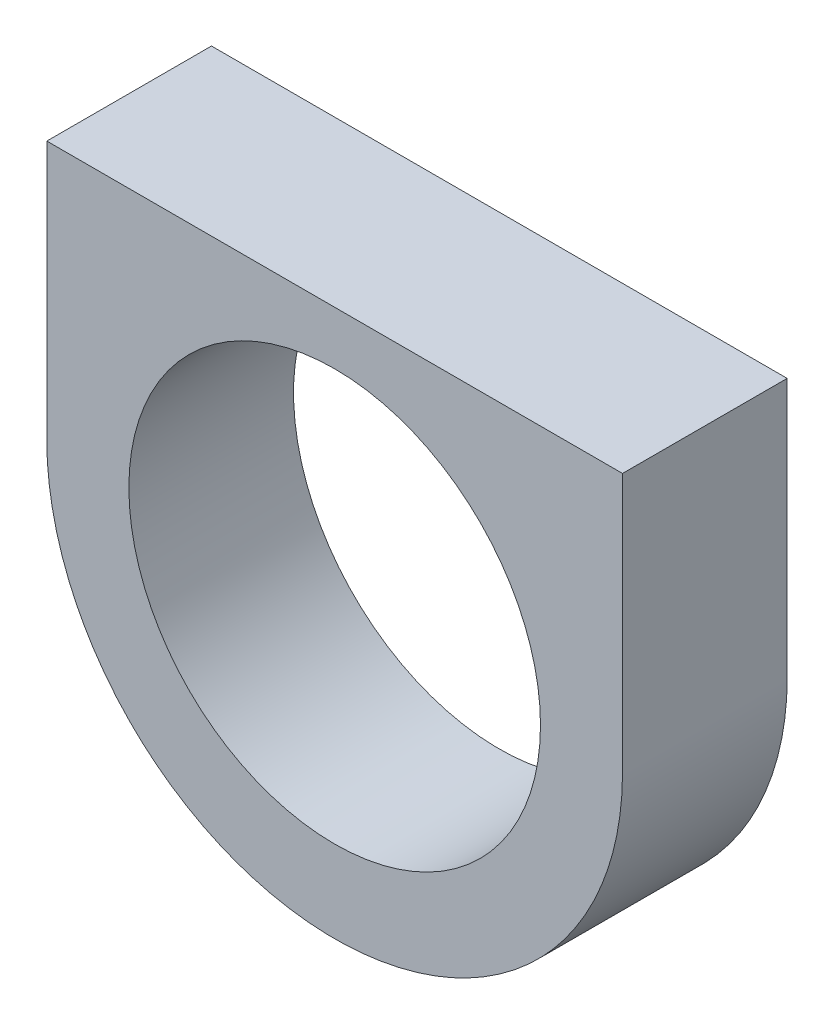
ISO-10303-21;
HEADER;
FILE_DESCRIPTION(('STEP AP214'),'2;1');
FILE_NAME('part.step','',(''),(''),'','','');
FILE_SCHEMA(('AUTOMOTIVE_DESIGN { 1 0 10303 214 1 1 1 1 }'));
ENDSEC;
DATA;
#1=APPLICATION_CONTEXT('core data for automotive mechanical design processes');
#2=APPLICATION_PROTOCOL_DEFINITION('international standard','automotive_design',2000,#1);
#3=PRODUCT_CONTEXT('',#1,'mechanical');
#4=PRODUCT('Part','Part','',(#3));
#5=PRODUCT_RELATED_PRODUCT_CATEGORY('part','',(#4));
#6=PRODUCT_DEFINITION_FORMATION('','',#4);
#7=PRODUCT_DEFINITION_CONTEXT('part definition',#1,'design');
#8=PRODUCT_DEFINITION('design','',#6,#7);
#9=PRODUCT_DEFINITION_SHAPE('','',#8);
#10=(LENGTH_UNIT() NAMED_UNIT(*) SI_UNIT(.MILLI.,.METRE.));
#11=(NAMED_UNIT(*) PLANE_ANGLE_UNIT() SI_UNIT($,.RADIAN.));
#12=(NAMED_UNIT(*) SI_UNIT($,.STERADIAN.) SOLID_ANGLE_UNIT());
#13=UNCERTAINTY_MEASURE_WITH_UNIT(LENGTH_MEASURE(1.E-05),#10,'distance_accuracy_value','');
#14=(GEOMETRIC_REPRESENTATION_CONTEXT(3) GLOBAL_UNCERTAINTY_ASSIGNED_CONTEXT((#13)) GLOBAL_UNIT_ASSIGNED_CONTEXT((#10,
#11,#12)) REPRESENTATION_CONTEXT('',''));
#15=CARTESIAN_POINT('',(0.,0.,0.));
#16=DIRECTION('',(0.,0.,1.));
#17=DIRECTION('',(1.,0.,0.));
#18=AXIS2_PLACEMENT_3D('',#15,#16,#17);
#19=CARTESIAN_POINT('',(0.,-6.29483871022679,4.));
#20=DIRECTION('',(0.,0.,-1.));
#21=DIRECTION('',(-1.,0.,0.));
#22=AXIS2_PLACEMENT_3D('',#19,#20,#21);
#23=PLANE('',#22);
#24=CARTESIAN_POINT('',(0.,-6.29483871022679,4.));
#25=DIRECTION('',(0.,0.,-1.));
#26=DIRECTION('',(-1.,0.,0.));
#27=AXIS2_PLACEMENT_3D('',#24,#25,#26);
#28=CIRCLE('',#27,5.);
#29=CARTESIAN_POINT('',(-5.,-6.29483871022679,4.00000000000003));
#30=VERTEX_POINT('',#29);
#31=EDGE_CURVE('E187',#30,#30,#28,.T.);
#32=ORIENTED_EDGE('',*,*,#31,.T.);
#33=EDGE_LOOP('',(#32));
#34=FACE_BOUND('',#33,.T.);
#35=CARTESIAN_POINT('',(6.99313644755814,0.,3.99999999999995));
#36=CARTESIAN_POINT('',(6.99313644755813,-0.524569892518901,3.99999999999995));
#37=CARTESIAN_POINT('',(6.99313644755814,-1.5737096775567,3.99999999999995));
#38=CARTESIAN_POINT('',(6.99313644755813,-3.1474193551134,3.99999999999996));
#39=CARTESIAN_POINT('',(6.99313644755814,-4.7211290326701,3.99999999999995));
#40=CARTESIAN_POINT('',(6.99313644755813,-5.77026881770789,3.99999999999995));
#41=CARTESIAN_POINT('',(6.99313644755814,-7.2102381233053,3.99999999999995));
#42=CARTESIAN_POINT('',(6.62945758767232,-9.04065646147913,3.99999999999995));
#43=CARTESIAN_POINT('',(5.07370693415677,-11.3687045464022,3.99999999999996));
#44=CARTESIAN_POINT('',(2.74591097085421,-12.9240274470442,3.99999999999998));
#45=CARTESIAN_POINT('',(0.,-13.4703328281491,4.));
#46=CARTESIAN_POINT('',(-2.7459109708542,-12.9240274470442,4.00000000000002));
#47=CARTESIAN_POINT('',(-5.07370693415674,-11.3687045464022,4.00000000000004));
#48=CARTESIAN_POINT('',(-6.62945758767234,-9.04065646147917,4.00000000000004));
#49=CARTESIAN_POINT('',(-6.99313644755814,-7.2102381233053,4.00000000000005));
#50=CARTESIAN_POINT('',(-6.99313644755814,-5.77026881770789,4.00000000000005));
#51=CARTESIAN_POINT('',(-6.99313644755814,-4.72112903267009,4.00000000000005));
#52=CARTESIAN_POINT('',(-6.99313644755814,-3.14741935511339,4.00000000000005));
#53=CARTESIAN_POINT('',(-6.99313644755813,-1.5737096775567,4.00000000000005));
#54=CARTESIAN_POINT('',(-6.99313644755814,-0.524569892518897,4.00000000000005));
#55=CARTESIAN_POINT('',(-6.99313644755814,0.,4.00000000000005));
#56=B_SPLINE_CURVE_WITH_KNOTS('',3,(#35,#36,#37,#38,#39,#40,#41,#42,#43,#44,#45,#46,#47,#48,#49,
#50,#51,#52,#53,#54,#55),.UNSPECIFIED.,.F.,.F.,(4,1,1,1,2,1,1,1,1,1,1,1,2,1,1,1,4),(0.,
0.0455365513537961,0.0910731027075922,0.136609654061388,0.182146205415184,0.261609654061388,
0.341073102707592,0.420536551353796,0.5,0.579463448646204,0.658926897292408,0.738390345938612,
0.817853794584815,0.863390345938612,0.908926897292408,0.954463448646204,1.),.UNSPECIFIED.);
#57=CARTESIAN_POINT('',(6.99313644755814,0.,3.99999999999995));
#58=VERTEX_POINT('',#57);
#59=CARTESIAN_POINT('',(6.99313644755813,-6.29483871022679,3.99999999999995));
#60=VERTEX_POINT('',#59);
#61=EDGE_CURVE('E184',#58,#60,#56,.T.);
#62=ORIENTED_EDGE('',*,*,#61,.F.);
#63=CARTESIAN_POINT('',(-6.99313644755814,0.,4.00000000000005));
#64=DIRECTION('',(1.,0.,0.));
#65=VECTOR('',#64,1.);
#66=LINE('',#63,#65);
#67=CARTESIAN_POINT('',(-6.99313644755814,0.,4.00000000000005));
#68=VERTEX_POINT('',#67);
#69=EDGE_CURVE('E12',#68,#58,#66,.T.);
#70=ORIENTED_EDGE('',*,*,#69,.F.);
#71=CARTESIAN_POINT('',(6.99313644755814,0.,3.99999999999995));
#72=CARTESIAN_POINT('',(6.99313644755813,-0.524569892518901,3.99999999999995));
#73=CARTESIAN_POINT('',(6.99313644755814,-1.5737096775567,3.99999999999995));
#74=CARTESIAN_POINT('',(6.99313644755813,-3.1474193551134,3.99999999999996));
#75=CARTESIAN_POINT('',(6.99313644755814,-4.7211290326701,3.99999999999995));
#76=CARTESIAN_POINT('',(6.99313644755813,-5.77026881770789,3.99999999999995));
#77=CARTESIAN_POINT('',(6.99313644755814,-7.2102381233053,3.99999999999995));
#78=CARTESIAN_POINT('',(6.62945758767232,-9.04065646147913,3.99999999999995));
#79=CARTESIAN_POINT('',(5.07370693415677,-11.3687045464022,3.99999999999996));
#80=CARTESIAN_POINT('',(2.74591097085421,-12.9240274470442,3.99999999999998));
#81=CARTESIAN_POINT('',(0.,-13.4703328281491,4.));
#82=CARTESIAN_POINT('',(-2.7459109708542,-12.9240274470442,4.00000000000002));
#83=CARTESIAN_POINT('',(-5.07370693415674,-11.3687045464022,4.00000000000004));
#84=CARTESIAN_POINT('',(-6.62945758767234,-9.04065646147917,4.00000000000004));
#85=CARTESIAN_POINT('',(-6.99313644755814,-7.2102381233053,4.00000000000005));
#86=CARTESIAN_POINT('',(-6.99313644755814,-5.77026881770789,4.00000000000005));
#87=CARTESIAN_POINT('',(-6.99313644755814,-4.72112903267009,4.00000000000005));
#88=CARTESIAN_POINT('',(-6.99313644755814,-3.14741935511339,4.00000000000005));
#89=CARTESIAN_POINT('',(-6.99313644755813,-1.5737096775567,4.00000000000005));
#90=CARTESIAN_POINT('',(-6.99313644755814,-0.524569892518897,4.00000000000005));
#91=CARTESIAN_POINT('',(-6.99313644755814,0.,4.00000000000005));
#92=B_SPLINE_CURVE_WITH_KNOTS('',3,(#71,#72,#73,#74,#75,#76,#77,#78,#79,#80,#81,#82,#83,#84,#85,
#86,#87,#88,#89,#90,#91),.UNSPECIFIED.,.F.,.F.,(4,1,1,1,2,1,1,1,1,1,1,1,2,1,1,1,4),(0.,
0.0455365513537961,0.0910731027075922,0.136609654061388,0.182146205415184,0.261609654061388,
0.341073102707592,0.420536551353796,0.5,0.579463448646204,0.658926897292408,0.738390345938612,
0.817853794584815,0.863390345938612,0.908926897292408,0.954463448646204,1.),.UNSPECIFIED.);
#93=CARTESIAN_POINT('',(-6.99313644755814,-6.29483871022679,4.00000000000005));
#94=VERTEX_POINT('',#93);
#95=EDGE_CURVE('E66',#94,#68,#92,.T.);
#96=ORIENTED_EDGE('',*,*,#95,.F.);
#97=CARTESIAN_POINT('',(6.99313644755814,0.,3.99999999999995));
#98=CARTESIAN_POINT('',(6.99313644755813,-0.524569892518901,3.99999999999995));
#99=CARTESIAN_POINT('',(6.99313644755814,-1.5737096775567,3.99999999999995));
#100=CARTESIAN_POINT('',(6.99313644755813,-3.1474193551134,3.99999999999996));
#101=CARTESIAN_POINT('',(6.99313644755814,-4.7211290326701,3.99999999999995));
#102=CARTESIAN_POINT('',(6.99313644755813,-5.77026881770789,3.99999999999995));
#103=CARTESIAN_POINT('',(6.99313644755814,-7.2102381233053,3.99999999999995));
#104=CARTESIAN_POINT('',(6.62945758767232,-9.04065646147913,3.99999999999995));
#105=CARTESIAN_POINT('',(5.07370693415677,-11.3687045464022,3.99999999999996));
#106=CARTESIAN_POINT('',(2.74591097085421,-12.9240274470442,3.99999999999998));
#107=CARTESIAN_POINT('',(0.,-13.4703328281491,4.));
#108=CARTESIAN_POINT('',(-2.7459109708542,-12.9240274470442,4.00000000000002));
#109=CARTESIAN_POINT('',(-5.07370693415674,-11.3687045464022,4.00000000000004));
#110=CARTESIAN_POINT('',(-6.62945758767234,-9.04065646147917,4.00000000000004));
#111=CARTESIAN_POINT('',(-6.99313644755814,-7.2102381233053,4.00000000000005));
#112=CARTESIAN_POINT('',(-6.99313644755814,-5.77026881770789,4.00000000000005));
#113=CARTESIAN_POINT('',(-6.99313644755814,-4.72112903267009,4.00000000000005));
#114=CARTESIAN_POINT('',(-6.99313644755814,-3.14741935511339,4.00000000000005));
#115=CARTESIAN_POINT('',(-6.99313644755813,-1.5737096775567,4.00000000000005));
#116=CARTESIAN_POINT('',(-6.99313644755814,-0.524569892518897,4.00000000000005));
#117=CARTESIAN_POINT('',(-6.99313644755814,0.,4.00000000000005));
#118=B_SPLINE_CURVE_WITH_KNOTS('',3,(#97,#98,#99,#100,#101,#102,#103,#104,#105,#106,#107,#108,
#109,#110,#111,#112,#113,#114,#115,#116,#117),.UNSPECIFIED.,.F.,.F.,(4,1,1,1,2,1,1,1,1,1,1,1,2,
1,1,1,4),(0.,0.0455365513537961,0.0910731027075922,0.136609654061388,0.182146205415184,
0.261609654061388,0.341073102707592,0.420536551353796,0.5,0.579463448646204,0.658926897292408,
0.738390345938612,0.817853794584815,0.863390345938612,0.908926897292408,0.954463448646204,1.),.UNSPECIFIED.);
#119=EDGE_CURVE('E73',#60,#94,#118,.T.);
#120=ORIENTED_EDGE('',*,*,#119,.F.);
#121=EDGE_LOOP('',(#62,#70,#96,#120));
#122=FACE_BOUND('',#121,.T.);
#123=ADVANCED_FACE('F57',(#34,#122),#23,.F.);
#124=CARTESIAN_POINT('',(0.,-6.29483871022679,0.));
#125=DIRECTION('',(0.,0.,1.));
#126=DIRECTION('',(1.,0.,0.));
#127=AXIS2_PLACEMENT_3D('',#124,#125,#126);
#128=PLANE('',#127);
#129=CARTESIAN_POINT('',(0.,-6.29483871022679,0.));
#130=DIRECTION('',(0.,0.,1.));
#131=DIRECTION('',(1.,0.,0.));
#132=AXIS2_PLACEMENT_3D('',#129,#130,#131);
#133=CIRCLE('',#132,5.);
#134=CARTESIAN_POINT('',(5.,-6.29483871022679,0.));
#135=VERTEX_POINT('',#134);
#136=EDGE_CURVE('E61',#135,#135,#133,.T.);
#137=ORIENTED_EDGE('',*,*,#136,.T.);
#138=EDGE_LOOP('',(#137));
#139=FACE_BOUND('',#138,.T.);
#140=CARTESIAN_POINT('',(-6.99313644755814,0.,0.));
#141=CARTESIAN_POINT('',(-6.99313644755814,-0.524569892518902,0.));
#142=CARTESIAN_POINT('',(-6.99313644755814,-1.5737096775567,0.));
#143=CARTESIAN_POINT('',(-6.99313644755813,-3.1474193551134,0.));
#144=CARTESIAN_POINT('',(-6.99313644755813,-4.72112903267009,0.));
#145=CARTESIAN_POINT('',(-6.99313644755813,-5.77026881770789,0.));
#146=CARTESIAN_POINT('',(-6.99313644755814,-7.2102381233053,0.));
#147=CARTESIAN_POINT('',(-6.62945758767233,-9.04065646147914,0.));
#148=CARTESIAN_POINT('',(-5.07370693415675,-11.3687045464022,0.));
#149=CARTESIAN_POINT('',(-2.7459109708542,-12.9240274470442,0.));
#150=CARTESIAN_POINT('',(0.,-13.4703328281492,0.));
#151=CARTESIAN_POINT('',(2.74591097085421,-12.9240274470442,0.));
#152=CARTESIAN_POINT('',(5.07370693415677,-11.3687045464022,0.));
#153=CARTESIAN_POINT('',(6.62945758767232,-9.04065646147911,0.));
#154=CARTESIAN_POINT('',(6.99313644755814,-7.2102381233053,0.));
#155=CARTESIAN_POINT('',(6.99313644755814,-5.77026881770789,0.));
#156=CARTESIAN_POINT('',(6.99313644755813,-4.7211290326701,0.));
#157=CARTESIAN_POINT('',(6.99313644755814,-3.1474193551134,0.));
#158=CARTESIAN_POINT('',(6.99313644755814,-1.5737096775567,0.));
#159=CARTESIAN_POINT('',(6.99313644755813,-0.524569892518896,0.));
#160=CARTESIAN_POINT('',(6.99313644755814,0.,0.));
#161=B_SPLINE_CURVE_WITH_KNOTS('',3,(#140,#141,#142,#143,#144,#145,#146,#147,#148,#149,#150,
#151,#152,#153,#154,#155,#156,#157,#158,#159,#160),.UNSPECIFIED.,.F.,.F.,(4,1,1,1,2,1,1,1,1,1,1,
1,2,1,1,1,4),(0.,0.0455365513537961,0.0910731027075923,0.136609654061388,0.182146205415185,
0.261609654061388,0.341073102707592,0.420536551353796,0.5,0.579463448646204,0.658926897292408,
0.738390345938612,0.817853794584816,0.863390345938612,0.908926897292408,0.954463448646204,1.),.UNSPECIFIED.);
#162=CARTESIAN_POINT('',(-6.99313644755814,0.,0.));
#163=VERTEX_POINT('',#162);
#164=CARTESIAN_POINT('',(-6.99313644755813,-6.29483871022679,0.));
#165=VERTEX_POINT('',#164);
#166=EDGE_CURVE('E181',#163,#165,#161,.T.);
#167=ORIENTED_EDGE('',*,*,#166,.F.);
#168=CARTESIAN_POINT('',(0.,0.,0.));
#169=DIRECTION('',(-1.,0.,0.));
#170=VECTOR('',#169,1.);
#171=LINE('',#168,#170);
#172=CARTESIAN_POINT('',(0.,0.,0.));
#173=VERTEX_POINT('',#172);
#174=EDGE_CURVE('E109',#173,#163,#171,.T.);
#175=ORIENTED_EDGE('',*,*,#174,.F.);
#176=CARTESIAN_POINT('',(6.99313644755814,0.,0.));
#177=DIRECTION('',(-1.,0.,0.));
#178=VECTOR('',#177,1.);
#179=LINE('',#176,#178);
#180=CARTESIAN_POINT('',(6.99313644755814,0.,0.));
#181=VERTEX_POINT('',#180);
#182=EDGE_CURVE('E101',#181,#173,#179,.T.);
#183=ORIENTED_EDGE('',*,*,#182,.F.);
#184=CARTESIAN_POINT('',(-6.99313644755814,0.,0.));
#185=CARTESIAN_POINT('',(-6.99313644755814,-0.524569892518902,0.));
#186=CARTESIAN_POINT('',(-6.99313644755814,-1.5737096775567,0.));
#187=CARTESIAN_POINT('',(-6.99313644755813,-3.1474193551134,0.));
#188=CARTESIAN_POINT('',(-6.99313644755813,-4.72112903267009,0.));
#189=CARTESIAN_POINT('',(-6.99313644755813,-5.77026881770789,0.));
#190=CARTESIAN_POINT('',(-6.99313644755814,-7.2102381233053,0.));
#191=CARTESIAN_POINT('',(-6.62945758767233,-9.04065646147914,0.));
#192=CARTESIAN_POINT('',(-5.07370693415675,-11.3687045464022,0.));
#193=CARTESIAN_POINT('',(-2.7459109708542,-12.9240274470442,0.));
#194=CARTESIAN_POINT('',(0.,-13.4703328281492,0.));
#195=CARTESIAN_POINT('',(2.74591097085421,-12.9240274470442,0.));
#196=CARTESIAN_POINT('',(5.07370693415677,-11.3687045464022,0.));
#197=CARTESIAN_POINT('',(6.62945758767232,-9.04065646147911,0.));
#198=CARTESIAN_POINT('',(6.99313644755814,-7.2102381233053,0.));
#199=CARTESIAN_POINT('',(6.99313644755814,-5.77026881770789,0.));
#200=CARTESIAN_POINT('',(6.99313644755813,-4.7211290326701,0.));
#201=CARTESIAN_POINT('',(6.99313644755814,-3.1474193551134,0.));
#202=CARTESIAN_POINT('',(6.99313644755814,-1.5737096775567,0.));
#203=CARTESIAN_POINT('',(6.99313644755813,-0.524569892518896,0.));
#204=CARTESIAN_POINT('',(6.99313644755814,0.,0.));
#205=B_SPLINE_CURVE_WITH_KNOTS('',3,(#184,#185,#186,#187,#188,#189,#190,#191,#192,#193,#194,
#195,#196,#197,#198,#199,#200,#201,#202,#203,#204),.UNSPECIFIED.,.F.,.F.,(4,1,1,1,2,1,1,1,1,1,1,
1,2,1,1,1,4),(0.,0.0455365513537961,0.0910731027075923,0.136609654061388,0.182146205415185,
0.261609654061388,0.341073102707592,0.420536551353796,0.5,0.579463448646204,0.658926897292408,
0.738390345938612,0.817853794584816,0.863390345938612,0.908926897292408,0.954463448646204,1.),.UNSPECIFIED.);
#206=CARTESIAN_POINT('',(6.99313644755814,-6.29483871022679,0.));
#207=VERTEX_POINT('',#206);
#208=EDGE_CURVE('E106',#207,#181,#205,.T.);
#209=ORIENTED_EDGE('',*,*,#208,.F.);
#210=CARTESIAN_POINT('',(-6.99313644755814,0.,0.));
#211=CARTESIAN_POINT('',(-6.99313644755814,-0.524569892518902,0.));
#212=CARTESIAN_POINT('',(-6.99313644755814,-1.5737096775567,0.));
#213=CARTESIAN_POINT('',(-6.99313644755813,-3.1474193551134,0.));
#214=CARTESIAN_POINT('',(-6.99313644755813,-4.72112903267009,0.));
#215=CARTESIAN_POINT('',(-6.99313644755813,-5.77026881770789,0.));
#216=CARTESIAN_POINT('',(-6.99313644755814,-7.2102381233053,0.));
#217=CARTESIAN_POINT('',(-6.62945758767233,-9.04065646147914,0.));
#218=CARTESIAN_POINT('',(-5.07370693415675,-11.3687045464022,0.));
#219=CARTESIAN_POINT('',(-2.7459109708542,-12.9240274470442,0.));
#220=CARTESIAN_POINT('',(0.,-13.4703328281492,0.));
#221=CARTESIAN_POINT('',(2.74591097085421,-12.9240274470442,0.));
#222=CARTESIAN_POINT('',(5.07370693415677,-11.3687045464022,0.));
#223=CARTESIAN_POINT('',(6.62945758767232,-9.04065646147911,0.));
#224=CARTESIAN_POINT('',(6.99313644755814,-7.2102381233053,0.));
#225=CARTESIAN_POINT('',(6.99313644755814,-5.77026881770789,0.));
#226=CARTESIAN_POINT('',(6.99313644755813,-4.7211290326701,0.));
#227=CARTESIAN_POINT('',(6.99313644755814,-3.1474193551134,0.));
#228=CARTESIAN_POINT('',(6.99313644755814,-1.5737096775567,0.));
#229=CARTESIAN_POINT('',(6.99313644755813,-0.524569892518896,0.));
#230=CARTESIAN_POINT('',(6.99313644755814,0.,0.));
#231=B_SPLINE_CURVE_WITH_KNOTS('',3,(#210,#211,#212,#213,#214,#215,#216,#217,#218,#219,#220,
#221,#222,#223,#224,#225,#226,#227,#228,#229,#230),.UNSPECIFIED.,.F.,.F.,(4,1,1,1,2,1,1,1,1,1,1,
1,2,1,1,1,4),(0.,0.0455365513537961,0.0910731027075923,0.136609654061388,0.182146205415185,
0.261609654061388,0.341073102707592,0.420536551353796,0.5,0.579463448646204,0.658926897292408,
0.738390345938612,0.817853794584816,0.863390345938612,0.908926897292408,0.954463448646204,1.),.UNSPECIFIED.);
#232=EDGE_CURVE('E122',#165,#207,#231,.T.);
#233=ORIENTED_EDGE('',*,*,#232,.F.);
#234=EDGE_LOOP('',(#167,#175,#183,#209,#233));
#235=FACE_BOUND('',#234,.T.);
#236=ADVANCED_FACE('F105',(#139,#235),#128,.F.);
#237=CARTESIAN_POINT('',(6.99313644755814,0.,0.));
#238=DIRECTION('',(0.,1.,0.));
#239=DIRECTION('',(-1.,0.,0.));
#240=AXIS2_PLACEMENT_3D('',#237,#238,#239);
#241=PLANE('',#240);
#242=ORIENTED_EDGE('',*,*,#182,.T.);
#243=ORIENTED_EDGE('',*,*,#174,.T.);
#244=CARTESIAN_POINT('',(-6.99313644755814,0.,4.00000000000005));
#245=CARTESIAN_POINT('',(-6.99313644755814,0.,0.));
#246=B_SPLINE_CURVE_WITH_KNOTS('',1,(#244,#245),.UNSPECIFIED.,.F.,.F.,(2,2),(0.,1.),.UNSPECIFIED.);
#247=EDGE_CURVE('E130',#163,#68,#246,.F.);
#248=ORIENTED_EDGE('',*,*,#247,.T.);
#249=ORIENTED_EDGE('',*,*,#69,.T.);
#250=CARTESIAN_POINT('',(6.99313644755814,0.,0.));
#251=CARTESIAN_POINT('',(6.99313644755814,0.,3.99999999999995));
#252=B_SPLINE_CURVE_WITH_KNOTS('',1,(#250,#251),.UNSPECIFIED.,.F.,.F.,(2,2),(0.,1.),.UNSPECIFIED.);
#253=EDGE_CURVE('E114',#58,#181,#252,.F.);
#254=ORIENTED_EDGE('',*,*,#253,.T.);
#255=EDGE_LOOP('',(#242,#243,#248,#249,#254));
#256=FACE_BOUND('',#255,.T.);
#257=ADVANCED_FACE('F127',(#256),#241,.T.);
#258=CARTESIAN_POINT('',(-6.99313644755814,0.,0.));
#259=CARTESIAN_POINT('',(-6.99313644755814,0.,4.00000000000005));
#260=CARTESIAN_POINT('',(-6.99313644755814,-0.524569892518902,0.));
#261=CARTESIAN_POINT('',(-6.99313644755814,-0.524569892518897,4.00000000000005));
#262=CARTESIAN_POINT('',(-6.99313644755814,-1.5737096775567,0.));
#263=CARTESIAN_POINT('',(-6.99313644755813,-1.5737096775567,4.00000000000005));
#264=CARTESIAN_POINT('',(-6.99313644755813,-3.1474193551134,0.));
#265=CARTESIAN_POINT('',(-6.99313644755814,-3.14741935511339,4.00000000000005));
#266=CARTESIAN_POINT('',(-6.99313644755813,-4.72112903267009,0.));
#267=CARTESIAN_POINT('',(-6.99313644755814,-4.72112903267009,4.00000000000005));
#268=CARTESIAN_POINT('',(-6.99313644755813,-5.77026881770789,0.));
#269=CARTESIAN_POINT('',(-6.99313644755814,-5.77026881770789,4.00000000000005));
#270=CARTESIAN_POINT('',(-6.99313644755814,-7.2102381233053,0.));
#271=CARTESIAN_POINT('',(-6.99313644755814,-7.2102381233053,4.00000000000005));
#272=CARTESIAN_POINT('',(-6.62945758767233,-9.04065646147914,0.));
#273=CARTESIAN_POINT('',(-6.62945758767234,-9.04065646147917,4.00000000000004));
#274=CARTESIAN_POINT('',(-5.07370693415675,-11.3687045464022,0.));
#275=CARTESIAN_POINT('',(-5.07370693415674,-11.3687045464022,4.00000000000004));
#276=CARTESIAN_POINT('',(-2.7459109708542,-12.9240274470442,0.));
#277=CARTESIAN_POINT('',(-2.7459109708542,-12.9240274470442,4.00000000000002));
#278=CARTESIAN_POINT('',(0.,-13.4703328281492,0.));
#279=CARTESIAN_POINT('',(0.,-13.4703328281491,4.));
#280=CARTESIAN_POINT('',(2.74591097085421,-12.9240274470442,0.));
#281=CARTESIAN_POINT('',(2.74591097085421,-12.9240274470442,3.99999999999998));
#282=CARTESIAN_POINT('',(5.07370693415677,-11.3687045464022,0.));
#283=CARTESIAN_POINT('',(5.07370693415677,-11.3687045464022,3.99999999999996));
#284=CARTESIAN_POINT('',(6.62945758767232,-9.04065646147911,0.));
#285=CARTESIAN_POINT('',(6.62945758767232,-9.04065646147913,3.99999999999995));
#286=CARTESIAN_POINT('',(6.99313644755814,-7.2102381233053,0.));
#287=CARTESIAN_POINT('',(6.99313644755814,-7.2102381233053,3.99999999999995));
#288=CARTESIAN_POINT('',(6.99313644755814,-5.77026881770789,0.));
#289=CARTESIAN_POINT('',(6.99313644755813,-5.77026881770789,3.99999999999995));
#290=CARTESIAN_POINT('',(6.99313644755813,-4.7211290326701,0.));
#291=CARTESIAN_POINT('',(6.99313644755814,-4.7211290326701,3.99999999999995));
#292=CARTESIAN_POINT('',(6.99313644755814,-3.1474193551134,0.));
#293=CARTESIAN_POINT('',(6.99313644755813,-3.1474193551134,3.99999999999996));
#294=CARTESIAN_POINT('',(6.99313644755814,-1.5737096775567,0.));
#295=CARTESIAN_POINT('',(6.99313644755814,-1.5737096775567,3.99999999999995));
#296=CARTESIAN_POINT('',(6.99313644755813,-0.524569892518896,0.));
#297=CARTESIAN_POINT('',(6.99313644755813,-0.524569892518901,3.99999999999995));
#298=CARTESIAN_POINT('',(6.99313644755814,0.,0.));
#299=CARTESIAN_POINT('',(6.99313644755814,0.,3.99999999999995));
#300=B_SPLINE_SURFACE_WITH_KNOTS('',3,1,((#258,#259),(#260,#261),(#262,#263),(#264,#265),(#266,
#267),(#268,#269),(#270,#271),(#272,#273),(#274,#275),(#276,#277),(#278,#279),(#280,#281),(#282,
#283),(#284,#285),(#286,#287),(#288,#289),(#290,#291),(#292,#293),(#294,#295),(#296,#297),(#298,
#299)),.UNSPECIFIED.,.F.,.F.,.F.,(4,1,1,1,2,1,1,1,1,1,1,1,2,1,1,1,4),(2,2),(0.,
0.0455365513537961,0.0910731027075923,0.136609654061388,0.182146205415185,0.261609654061388,
0.341073102707592,0.420536551353796,0.5,0.579463448646204,0.658926897292408,0.738390345938612,
0.817853794584816,0.863390345938612,0.908926897292408,0.954463448646204,1.),(0.,1.),.UNSPECIFIED.);
#301=ORIENTED_EDGE('',*,*,#166,.T.);
#302=ORIENTED_EDGE('',*,*,#232,.T.);
#303=ORIENTED_EDGE('',*,*,#208,.T.);
#304=ORIENTED_EDGE('',*,*,#253,.F.);
#305=ORIENTED_EDGE('',*,*,#61,.T.);
#306=ORIENTED_EDGE('',*,*,#119,.T.);
#307=ORIENTED_EDGE('',*,*,#95,.T.);
#308=ORIENTED_EDGE('',*,*,#247,.F.);
#309=EDGE_LOOP('',(#301,#302,#303,#304,#305,#306,#307,#308));
#310=FACE_BOUND('',#309,.T.);
#311=ADVANCED_FACE('F120',(#310),#300,.T.);
#312=CARTESIAN_POINT('',(0.,-6.29483871022679,-0.005));
#313=DIRECTION('',(0.,0.,1.));
#314=DIRECTION('',(1.,0.,0.));
#315=AXIS2_PLACEMENT_3D('',#312,#313,#314);
#316=CYLINDRICAL_SURFACE('',#315,5.);
#317=ORIENTED_EDGE('',*,*,#136,.F.);
#318=EDGE_LOOP('',(#317));
#319=FACE_BOUND('',#318,.T.);
#320=ORIENTED_EDGE('',*,*,#31,.F.);
#321=EDGE_LOOP('',(#320));
#322=FACE_BOUND('',#321,.T.);
#323=ADVANCED_FACE('F293',(#319,#322),#316,.F.);
#324=CLOSED_SHELL('',(#123,#236,#257,#311,#323));
#325=MANIFOLD_SOLID_BREP('B2',#324);
#326=ADVANCED_BREP_SHAPE_REPRESENTATION('',(#18,#325),#14);
#327=SHAPE_DEFINITION_REPRESENTATION(#9,#326);
ENDSEC;
END-ISO-10303-21;
